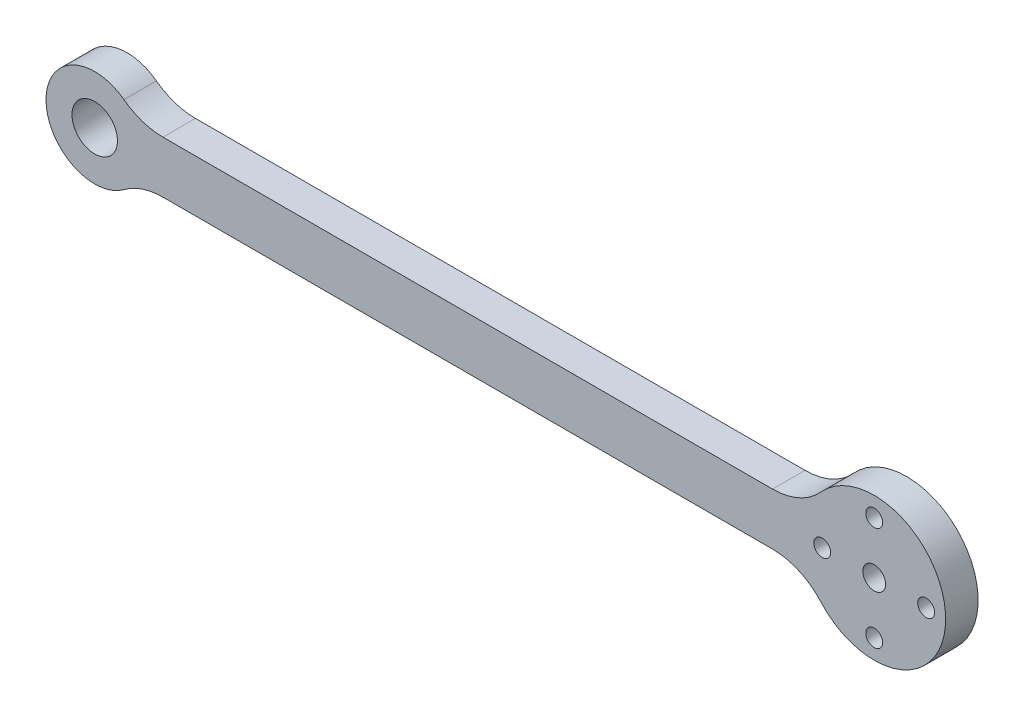
ISO-10303-21;
HEADER;
FILE_DESCRIPTION(('STEP AP214'),'2;1');
FILE_NAME('part.step','',(''),(''),'','','');
FILE_SCHEMA(('AUTOMOTIVE_DESIGN { 1 0 10303 214 1 1 1 1 }'));
ENDSEC;
DATA;
#1=APPLICATION_CONTEXT('core data for automotive mechanical design processes');
#2=APPLICATION_PROTOCOL_DEFINITION('international standard','automotive_design',2000,#1);
#3=PRODUCT_CONTEXT('',#1,'mechanical');
#4=PRODUCT('Part','Part','',(#3));
#5=PRODUCT_RELATED_PRODUCT_CATEGORY('part','',(#4));
#6=PRODUCT_DEFINITION_FORMATION('','',#4);
#7=PRODUCT_DEFINITION_CONTEXT('part definition',#1,'design');
#8=PRODUCT_DEFINITION('design','',#6,#7);
#9=PRODUCT_DEFINITION_SHAPE('','',#8);
#10=(LENGTH_UNIT() NAMED_UNIT(*) SI_UNIT(.MILLI.,.METRE.));
#11=(NAMED_UNIT(*) PLANE_ANGLE_UNIT() SI_UNIT($,.RADIAN.));
#12=(NAMED_UNIT(*) SI_UNIT($,.STERADIAN.) SOLID_ANGLE_UNIT());
#13=UNCERTAINTY_MEASURE_WITH_UNIT(LENGTH_MEASURE(1.E-05),#10,'distance_accuracy_value','');
#14=(GEOMETRIC_REPRESENTATION_CONTEXT(3) GLOBAL_UNCERTAINTY_ASSIGNED_CONTEXT((#13)) GLOBAL_UNIT_ASSIGNED_CONTEXT((#10,
#11,#12)) REPRESENTATION_CONTEXT('',''));
#15=CARTESIAN_POINT('',(0.,0.,0.));
#16=DIRECTION('',(0.,0.,1.));
#17=DIRECTION('',(1.,0.,0.));
#18=AXIS2_PLACEMENT_3D('',#15,#16,#17);
#19=CARTESIAN_POINT('',(0.,0.,-5.));
#20=DIRECTION('',(0.,0.,1.));
#21=DIRECTION('',(1.,0.,0.));
#22=AXIS2_PLACEMENT_3D('',#19,#20,#21);
#23=CYLINDRICAL_SURFACE('',#22,7.5);
#24=CARTESIAN_POINT('',(0.,0.,0.));
#25=DIRECTION('',(0.,0.,1.));
#26=DIRECTION('',(1.,0.,0.));
#27=AXIS2_PLACEMENT_3D('',#24,#25,#26);
#28=CIRCLE('',#27,7.5);
#29=CARTESIAN_POINT('',(4.5,6.,0.));
#30=VERTEX_POINT('',#29);
#31=CARTESIAN_POINT('',(4.5,-6.,0.));
#32=VERTEX_POINT('',#31);
#33=EDGE_CURVE('E174',#30,#32,#28,.T.);
#34=ORIENTED_EDGE('',*,*,#33,.F.);
#35=DIRECTION('',(0.,0.,1.));
#36=VECTOR('',#35,1.);
#37=CARTESIAN_POINT('',(4.5,6.,-5.));
#38=LINE('',#37,#36);
#39=CARTESIAN_POINT('',(4.5,6.,-5.));
#40=VERTEX_POINT('',#39);
#41=EDGE_CURVE('E121',#30,#40,#38,.F.);
#42=ORIENTED_EDGE('',*,*,#41,.T.);
#43=CARTESIAN_POINT('',(0.,0.,-5.));
#44=DIRECTION('',(0.,0.,1.));
#45=DIRECTION('',(1.,0.,0.));
#46=AXIS2_PLACEMENT_3D('',#43,#44,#45);
#47=CIRCLE('',#46,7.5);
#48=CARTESIAN_POINT('',(4.5,-6.,-5.));
#49=VERTEX_POINT('',#48);
#50=EDGE_CURVE('E112',#40,#49,#47,.T.);
#51=ORIENTED_EDGE('',*,*,#50,.T.);
#52=DIRECTION('',(0.,0.,1.));
#53=VECTOR('',#52,1.);
#54=CARTESIAN_POINT('',(4.5,-6.,-5.));
#55=LINE('',#54,#53);
#56=EDGE_CURVE('E129',#49,#32,#55,.T.);
#57=ORIENTED_EDGE('',*,*,#56,.T.);
#58=EDGE_LOOP('',(#34,#42,#51,#57));
#59=FACE_BOUND('',#58,.T.);
#60=ADVANCED_FACE('F37',(#59),#23,.T.);
#61=CARTESIAN_POINT('',(6.34428877022476,4.,-5.));
#62=DIRECTION('',(0.,1.,0.));
#63=DIRECTION('',(0.,0.,1.));
#64=AXIS2_PLACEMENT_3D('',#61,#62,#63);
#65=PLANE('',#64);
#66=DIRECTION('',(-1.,0.,0.));
#67=VECTOR('',#66,1.);
#68=CARTESIAN_POINT('',(6.34428877022476,4.,0.));
#69=LINE('',#68,#67);
#70=CARTESIAN_POINT('',(104.347524157501,4.,0.));
#71=VERTEX_POINT('',#70);
#72=CARTESIAN_POINT('',(10.5,4.,0.));
#73=VERTEX_POINT('',#72);
#74=EDGE_CURVE('E101',#71,#73,#69,.T.);
#75=ORIENTED_EDGE('',*,*,#74,.F.);
#76=DIRECTION('',(0.,0.,-1.));
#77=VECTOR('',#76,1.);
#78=CARTESIAN_POINT('',(104.347524157501,4.,-5.));
#79=LINE('',#78,#77);
#80=CARTESIAN_POINT('',(104.347524157501,4.,-5.));
#81=VERTEX_POINT('',#80);
#82=EDGE_CURVE('E149',#71,#81,#79,.T.);
#83=ORIENTED_EDGE('',*,*,#82,.T.);
#84=DIRECTION('',(-1.,0.,0.));
#85=VECTOR('',#84,1.);
#86=CARTESIAN_POINT('',(6.34428877022476,4.,-5.));
#87=LINE('',#86,#85);
#88=CARTESIAN_POINT('',(10.5,4.,-5.));
#89=VERTEX_POINT('',#88);
#90=EDGE_CURVE('E127',#81,#89,#87,.T.);
#91=ORIENTED_EDGE('',*,*,#90,.T.);
#92=DIRECTION('',(0.,0.,-1.));
#93=VECTOR('',#92,1.);
#94=CARTESIAN_POINT('',(10.5,4.,0.));
#95=LINE('',#94,#93);
#96=EDGE_CURVE('E120',#89,#73,#95,.F.);
#97=ORIENTED_EDGE('',*,*,#96,.T.);
#98=EDGE_LOOP('',(#75,#83,#91,#97));
#99=FACE_BOUND('',#98,.T.);
#100=ADVANCED_FACE('F125',(#99),#65,.T.);
#101=CARTESIAN_POINT('',(120.,0.,-5.));
#102=DIRECTION('',(0.,0.,1.));
#103=DIRECTION('',(1.,0.,0.));
#104=AXIS2_PLACEMENT_3D('',#101,#102,#103);
#105=CYLINDRICAL_SURFACE('',#104,11.);
#106=CARTESIAN_POINT('',(120.,0.,-5.));
#107=DIRECTION('',(0.,0.,1.));
#108=DIRECTION('',(1.,0.,0.));
#109=AXIS2_PLACEMENT_3D('',#106,#107,#108);
#110=CIRCLE('',#109,11.);
#111=CARTESIAN_POINT('',(111.801084082501,-7.33333333333334,-5.));
#112=VERTEX_POINT('',#111);
#113=CARTESIAN_POINT('',(111.801084082501,7.33333333333334,-5.));
#114=VERTEX_POINT('',#113);
#115=EDGE_CURVE('E133',#112,#114,#110,.T.);
#116=ORIENTED_EDGE('',*,*,#115,.T.);
#117=DIRECTION('',(0.,0.,1.));
#118=VECTOR('',#117,1.);
#119=CARTESIAN_POINT('',(111.801084082501,7.33333333333333,-5.));
#120=LINE('',#119,#118);
#121=CARTESIAN_POINT('',(111.801084082501,7.33333333333334,0.));
#122=VERTEX_POINT('',#121);
#123=EDGE_CURVE('E146',#114,#122,#120,.T.);
#124=ORIENTED_EDGE('',*,*,#123,.T.);
#125=CARTESIAN_POINT('',(120.,0.,0.));
#126=DIRECTION('',(0.,0.,1.));
#127=DIRECTION('',(1.,0.,0.));
#128=AXIS2_PLACEMENT_3D('',#125,#126,#127);
#129=CIRCLE('',#128,11.);
#130=CARTESIAN_POINT('',(111.801084082501,-7.33333333333334,0.));
#131=VERTEX_POINT('',#130);
#132=EDGE_CURVE('E113',#131,#122,#129,.T.);
#133=ORIENTED_EDGE('',*,*,#132,.F.);
#134=DIRECTION('',(0.,0.,1.));
#135=VECTOR('',#134,1.);
#136=CARTESIAN_POINT('',(111.801084082501,-7.33333333333333,-5.));
#137=LINE('',#136,#135);
#138=EDGE_CURVE('E144',#131,#112,#137,.F.);
#139=ORIENTED_EDGE('',*,*,#138,.T.);
#140=EDGE_LOOP('',(#116,#124,#133,#139));
#141=FACE_BOUND('',#140,.T.);
#142=ADVANCED_FACE('F161',(#141),#105,.T.);
#143=CARTESIAN_POINT('',(6.34428877022476,-4.,-5.));
#144=DIRECTION('',(0.,-1.,0.));
#145=DIRECTION('',(0.,0.,-1.));
#146=AXIS2_PLACEMENT_3D('',#143,#144,#145);
#147=PLANE('',#146);
#148=DIRECTION('',(1.,0.,0.));
#149=VECTOR('',#148,1.);
#150=CARTESIAN_POINT('',(6.34428877022476,-4.,-5.));
#151=LINE('',#150,#149);
#152=CARTESIAN_POINT('',(10.5,-4.,-5.));
#153=VERTEX_POINT('',#152);
#154=CARTESIAN_POINT('',(104.347524157501,-4.,-5.));
#155=VERTEX_POINT('',#154);
#156=EDGE_CURVE('E166',#153,#155,#151,.T.);
#157=ORIENTED_EDGE('',*,*,#156,.T.);
#158=DIRECTION('',(0.,0.,-1.));
#159=VECTOR('',#158,1.);
#160=CARTESIAN_POINT('',(104.347524157501,-4.,0.));
#161=LINE('',#160,#159);
#162=CARTESIAN_POINT('',(104.347524157501,-4.,0.));
#163=VERTEX_POINT('',#162);
#164=EDGE_CURVE('E151',#155,#163,#161,.F.);
#165=ORIENTED_EDGE('',*,*,#164,.T.);
#166=DIRECTION('',(1.,0.,0.));
#167=VECTOR('',#166,1.);
#168=CARTESIAN_POINT('',(6.34428877022476,-4.,0.));
#169=LINE('',#168,#167);
#170=CARTESIAN_POINT('',(10.5,-4.,0.));
#171=VERTEX_POINT('',#170);
#172=EDGE_CURVE('E158',#171,#163,#169,.T.);
#173=ORIENTED_EDGE('',*,*,#172,.F.);
#174=DIRECTION('',(0.,0.,-1.));
#175=VECTOR('',#174,1.);
#176=CARTESIAN_POINT('',(10.5,-4.,-5.));
#177=LINE('',#176,#175);
#178=EDGE_CURVE('E123',#171,#153,#177,.T.);
#179=ORIENTED_EDGE('',*,*,#178,.T.);
#180=EDGE_LOOP('',(#157,#165,#173,#179));
#181=FACE_BOUND('',#180,.T.);
#182=ADVANCED_FACE('F164',(#181),#147,.T.);
#183=CARTESIAN_POINT('',(0.,0.,-5.));
#184=DIRECTION('',(0.,0.,1.));
#185=DIRECTION('',(1.,0.,0.));
#186=AXIS2_PLACEMENT_3D('',#183,#184,#185);
#187=PLANE('',#186);
#188=CARTESIAN_POINT('',(120.,0.,-5.));
#189=DIRECTION('',(0.,0.,1.));
#190=DIRECTION('',(1.,0.,0.));
#191=AXIS2_PLACEMENT_3D('',#188,#189,#190);
#192=CIRCLE('',#191,1.75);
#193=CARTESIAN_POINT('',(121.75,0.,-5.));
#194=VERTEX_POINT('',#193);
#195=EDGE_CURVE('E206',#194,#194,#192,.T.);
#196=ORIENTED_EDGE('',*,*,#195,.T.);
#197=EDGE_LOOP('',(#196));
#198=FACE_BOUND('',#197,.T.);
#199=CARTESIAN_POINT('',(120.,8.00000000000001,-5.));
#200=DIRECTION('',(0.,0.,1.));
#201=DIRECTION('',(1.,0.,0.));
#202=AXIS2_PLACEMENT_3D('',#199,#200,#201);
#203=CIRCLE('',#202,1.29999999999999);
#204=CARTESIAN_POINT('',(121.3,8.00000000000001,-5.));
#205=VERTEX_POINT('',#204);
#206=EDGE_CURVE('E200',#205,#205,#203,.T.);
#207=ORIENTED_EDGE('',*,*,#206,.T.);
#208=EDGE_LOOP('',(#207));
#209=FACE_BOUND('',#208,.T.);
#210=CARTESIAN_POINT('',(128.,0.,-5.));
#211=DIRECTION('',(0.,0.,1.));
#212=DIRECTION('',(1.,0.,0.));
#213=AXIS2_PLACEMENT_3D('',#210,#211,#212);
#214=CIRCLE('',#213,1.30000000000001);
#215=CARTESIAN_POINT('',(129.3,0.,-5.));
#216=VERTEX_POINT('',#215);
#217=EDGE_CURVE('E194',#216,#216,#214,.T.);
#218=ORIENTED_EDGE('',*,*,#217,.T.);
#219=EDGE_LOOP('',(#218));
#220=FACE_BOUND('',#219,.T.);
#221=CARTESIAN_POINT('',(112.,0.,-5.));
#222=DIRECTION('',(0.,0.,1.));
#223=DIRECTION('',(1.,0.,0.));
#224=AXIS2_PLACEMENT_3D('',#221,#222,#223);
#225=CIRCLE('',#224,1.29999999999999);
#226=CARTESIAN_POINT('',(113.3,0.,-5.));
#227=VERTEX_POINT('',#226);
#228=EDGE_CURVE('E188',#227,#227,#225,.T.);
#229=ORIENTED_EDGE('',*,*,#228,.T.);
#230=EDGE_LOOP('',(#229));
#231=FACE_BOUND('',#230,.T.);
#232=CARTESIAN_POINT('',(120.,-8.00000000000001,-5.));
#233=DIRECTION('',(0.,0.,1.));
#234=DIRECTION('',(1.,0.,0.));
#235=AXIS2_PLACEMENT_3D('',#232,#233,#234);
#236=CIRCLE('',#235,1.29999999999999);
#237=CARTESIAN_POINT('',(121.3,-8.00000000000001,-5.));
#238=VERTEX_POINT('',#237);
#239=EDGE_CURVE('E183',#238,#238,#236,.T.);
#240=ORIENTED_EDGE('',*,*,#239,.T.);
#241=EDGE_LOOP('',(#240));
#242=FACE_BOUND('',#241,.T.);
#243=CARTESIAN_POINT('',(0.,0.,-5.));
#244=DIRECTION('',(0.,0.,1.));
#245=DIRECTION('',(1.,0.,0.));
#246=AXIS2_PLACEMENT_3D('',#243,#244,#245);
#247=CIRCLE('',#246,3.5);
#248=CARTESIAN_POINT('',(3.5,0.,-5.));
#249=VERTEX_POINT('',#248);
#250=EDGE_CURVE('E176',#249,#249,#247,.T.);
#251=ORIENTED_EDGE('',*,*,#250,.T.);
#252=EDGE_LOOP('',(#251));
#253=FACE_BOUND('',#252,.T.);
#254=ORIENTED_EDGE('',*,*,#50,.F.);
#255=CARTESIAN_POINT('',(10.5,14.,-5.));
#256=DIRECTION('',(0.,0.,1.));
#257=DIRECTION('',(1.,0.,0.));
#258=AXIS2_PLACEMENT_3D('',#255,#256,#257);
#259=CIRCLE('',#258,10.);
#260=EDGE_CURVE('E122',#40,#89,#259,.T.);
#261=ORIENTED_EDGE('',*,*,#260,.T.);
#262=ORIENTED_EDGE('',*,*,#90,.F.);
#263=CARTESIAN_POINT('',(104.347524157501,14.,-5.));
#264=DIRECTION('',(0.,0.,1.));
#265=DIRECTION('',(1.,0.,0.));
#266=AXIS2_PLACEMENT_3D('',#263,#264,#265);
#267=CIRCLE('',#266,10.);
#268=EDGE_CURVE('E154',#81,#114,#267,.T.);
#269=ORIENTED_EDGE('',*,*,#268,.T.);
#270=ORIENTED_EDGE('',*,*,#115,.F.);
#271=CARTESIAN_POINT('',(104.347524157501,-14.,-5.));
#272=DIRECTION('',(0.,0.,1.));
#273=DIRECTION('',(1.,0.,0.));
#274=AXIS2_PLACEMENT_3D('',#271,#272,#273);
#275=CIRCLE('',#274,10.);
#276=EDGE_CURVE('E11',#112,#155,#275,.T.);
#277=ORIENTED_EDGE('',*,*,#276,.T.);
#278=ORIENTED_EDGE('',*,*,#156,.F.);
#279=CARTESIAN_POINT('',(10.5,-14.,-5.));
#280=DIRECTION('',(0.,0.,1.));
#281=DIRECTION('',(1.,0.,0.));
#282=AXIS2_PLACEMENT_3D('',#279,#280,#281);
#283=CIRCLE('',#282,10.);
#284=EDGE_CURVE('E142',#153,#49,#283,.T.);
#285=ORIENTED_EDGE('',*,*,#284,.T.);
#286=EDGE_LOOP('',(#254,#261,#262,#269,#270,#277,#278,#285));
#287=FACE_BOUND('',#286,.T.);
#288=ADVANCED_FACE('F215',(#198,#209,#220,#231,#242,#253,#287),#187,.F.);
#289=CARTESIAN_POINT('',(0.,0.,0.));
#290=DIRECTION('',(0.,0.,1.));
#291=DIRECTION('',(1.,0.,0.));
#292=AXIS2_PLACEMENT_3D('',#289,#290,#291);
#293=PLANE('',#292);
#294=CARTESIAN_POINT('',(120.,0.,0.));
#295=DIRECTION('',(0.,0.,1.));
#296=DIRECTION('',(1.,0.,0.));
#297=AXIS2_PLACEMENT_3D('',#294,#295,#296);
#298=CIRCLE('',#297,1.75);
#299=CARTESIAN_POINT('',(121.75,0.,0.));
#300=VERTEX_POINT('',#299);
#301=EDGE_CURVE('E209',#300,#300,#298,.T.);
#302=ORIENTED_EDGE('',*,*,#301,.F.);
#303=EDGE_LOOP('',(#302));
#304=FACE_BOUND('',#303,.T.);
#305=CARTESIAN_POINT('',(120.,8.00000000000001,0.));
#306=DIRECTION('',(0.,0.,1.));
#307=DIRECTION('',(1.,0.,0.));
#308=AXIS2_PLACEMENT_3D('',#305,#306,#307);
#309=CIRCLE('',#308,1.29999999999999);
#310=CARTESIAN_POINT('',(121.3,8.00000000000001,0.));
#311=VERTEX_POINT('',#310);
#312=EDGE_CURVE('E203',#311,#311,#309,.T.);
#313=ORIENTED_EDGE('',*,*,#312,.F.);
#314=EDGE_LOOP('',(#313));
#315=FACE_BOUND('',#314,.T.);
#316=CARTESIAN_POINT('',(128.,0.,0.));
#317=DIRECTION('',(0.,0.,1.));
#318=DIRECTION('',(1.,0.,0.));
#319=AXIS2_PLACEMENT_3D('',#316,#317,#318);
#320=CIRCLE('',#319,1.30000000000001);
#321=CARTESIAN_POINT('',(129.3,0.,0.));
#322=VERTEX_POINT('',#321);
#323=EDGE_CURVE('E197',#322,#322,#320,.T.);
#324=ORIENTED_EDGE('',*,*,#323,.F.);
#325=EDGE_LOOP('',(#324));
#326=FACE_BOUND('',#325,.T.);
#327=CARTESIAN_POINT('',(112.,0.,0.));
#328=DIRECTION('',(0.,0.,1.));
#329=DIRECTION('',(1.,0.,0.));
#330=AXIS2_PLACEMENT_3D('',#327,#328,#329);
#331=CIRCLE('',#330,1.29999999999999);
#332=CARTESIAN_POINT('',(113.3,0.,0.));
#333=VERTEX_POINT('',#332);
#334=EDGE_CURVE('E191',#333,#333,#331,.T.);
#335=ORIENTED_EDGE('',*,*,#334,.F.);
#336=EDGE_LOOP('',(#335));
#337=FACE_BOUND('',#336,.T.);
#338=CARTESIAN_POINT('',(120.,-8.00000000000001,0.));
#339=DIRECTION('',(0.,0.,1.));
#340=DIRECTION('',(1.,0.,0.));
#341=AXIS2_PLACEMENT_3D('',#338,#339,#340);
#342=CIRCLE('',#341,1.29999999999999);
#343=CARTESIAN_POINT('',(121.3,-8.00000000000001,0.));
#344=VERTEX_POINT('',#343);
#345=EDGE_CURVE('E185',#344,#344,#342,.T.);
#346=ORIENTED_EDGE('',*,*,#345,.F.);
#347=EDGE_LOOP('',(#346));
#348=FACE_BOUND('',#347,.T.);
#349=CARTESIAN_POINT('',(0.,0.,0.));
#350=DIRECTION('',(0.,0.,1.));
#351=DIRECTION('',(1.,0.,0.));
#352=AXIS2_PLACEMENT_3D('',#349,#350,#351);
#353=CIRCLE('',#352,3.5);
#354=CARTESIAN_POINT('',(3.5,0.,0.));
#355=VERTEX_POINT('',#354);
#356=EDGE_CURVE('E178',#355,#355,#353,.T.);
#357=ORIENTED_EDGE('',*,*,#356,.F.);
#358=EDGE_LOOP('',(#357));
#359=FACE_BOUND('',#358,.T.);
#360=ORIENTED_EDGE('',*,*,#132,.T.);
#361=CARTESIAN_POINT('',(104.347524157501,14.,0.));
#362=DIRECTION('',(0.,0.,1.));
#363=DIRECTION('',(1.,0.,0.));
#364=AXIS2_PLACEMENT_3D('',#361,#362,#363);
#365=CIRCLE('',#364,10.);
#366=EDGE_CURVE('E108',#122,#71,#365,.F.);
#367=ORIENTED_EDGE('',*,*,#366,.T.);
#368=ORIENTED_EDGE('',*,*,#74,.T.);
#369=CARTESIAN_POINT('',(10.5,14.,0.));
#370=DIRECTION('',(0.,0.,1.));
#371=DIRECTION('',(1.,0.,0.));
#372=AXIS2_PLACEMENT_3D('',#369,#370,#371);
#373=CIRCLE('',#372,10.);
#374=EDGE_CURVE('E106',#73,#30,#373,.F.);
#375=ORIENTED_EDGE('',*,*,#374,.T.);
#376=ORIENTED_EDGE('',*,*,#33,.T.);
#377=CARTESIAN_POINT('',(10.5,-14.,0.));
#378=DIRECTION('',(0.,0.,1.));
#379=DIRECTION('',(1.,0.,0.));
#380=AXIS2_PLACEMENT_3D('',#377,#378,#379);
#381=CIRCLE('',#380,10.);
#382=EDGE_CURVE('E140',#32,#171,#381,.F.);
#383=ORIENTED_EDGE('',*,*,#382,.T.);
#384=ORIENTED_EDGE('',*,*,#172,.T.);
#385=CARTESIAN_POINT('',(104.347524157501,-14.,0.));
#386=DIRECTION('',(0.,0.,1.));
#387=DIRECTION('',(1.,0.,0.));
#388=AXIS2_PLACEMENT_3D('',#385,#386,#387);
#389=CIRCLE('',#388,10.);
#390=EDGE_CURVE('E45',#163,#131,#389,.F.);
#391=ORIENTED_EDGE('',*,*,#390,.T.);
#392=EDGE_LOOP('',(#360,#367,#368,#375,#376,#383,#384,#391));
#393=FACE_BOUND('',#392,.T.);
#394=ADVANCED_FACE('F104',(#304,#315,#326,#337,#348,#359,#393),#293,.T.);
#395=CARTESIAN_POINT('',(0.,0.,-5.));
#396=DIRECTION('',(0.,0.,1.));
#397=DIRECTION('',(1.,0.,0.));
#398=AXIS2_PLACEMENT_3D('',#395,#396,#397);
#399=CYLINDRICAL_SURFACE('',#398,3.5);
#400=ORIENTED_EDGE('',*,*,#250,.F.);
#401=EDGE_LOOP('',(#400));
#402=FACE_BOUND('',#401,.T.);
#403=ORIENTED_EDGE('',*,*,#356,.T.);
#404=EDGE_LOOP('',(#403));
#405=FACE_BOUND('',#404,.T.);
#406=ADVANCED_FACE('F227',(#402,#405),#399,.F.);
#407=CARTESIAN_POINT('',(120.,-8.00000000000001,-5.));
#408=DIRECTION('',(0.,0.,1.));
#409=DIRECTION('',(1.,0.,0.));
#410=AXIS2_PLACEMENT_3D('',#407,#408,#409);
#411=CYLINDRICAL_SURFACE('',#410,1.29999999999999);
#412=ORIENTED_EDGE('',*,*,#239,.F.);
#413=EDGE_LOOP('',(#412));
#414=FACE_BOUND('',#413,.T.);
#415=ORIENTED_EDGE('',*,*,#345,.T.);
#416=EDGE_LOOP('',(#415));
#417=FACE_BOUND('',#416,.T.);
#418=ADVANCED_FACE('F240',(#414,#417),#411,.F.);
#419=CARTESIAN_POINT('',(112.,0.,-5.));
#420=DIRECTION('',(0.,0.,1.));
#421=DIRECTION('',(1.,0.,0.));
#422=AXIS2_PLACEMENT_3D('',#419,#420,#421);
#423=CYLINDRICAL_SURFACE('',#422,1.29999999999999);
#424=ORIENTED_EDGE('',*,*,#228,.F.);
#425=EDGE_LOOP('',(#424));
#426=FACE_BOUND('',#425,.T.);
#427=ORIENTED_EDGE('',*,*,#334,.T.);
#428=EDGE_LOOP('',(#427));
#429=FACE_BOUND('',#428,.T.);
#430=ADVANCED_FACE('F246',(#426,#429),#423,.F.);
#431=CARTESIAN_POINT('',(128.,0.,-5.));
#432=DIRECTION('',(0.,0.,1.));
#433=DIRECTION('',(1.,0.,0.));
#434=AXIS2_PLACEMENT_3D('',#431,#432,#433);
#435=CYLINDRICAL_SURFACE('',#434,1.30000000000001);
#436=ORIENTED_EDGE('',*,*,#217,.F.);
#437=EDGE_LOOP('',(#436));
#438=FACE_BOUND('',#437,.T.);
#439=ORIENTED_EDGE('',*,*,#323,.T.);
#440=EDGE_LOOP('',(#439));
#441=FACE_BOUND('',#440,.T.);
#442=ADVANCED_FACE('F339',(#438,#441),#435,.F.);
#443=CARTESIAN_POINT('',(120.,8.00000000000001,-5.));
#444=DIRECTION('',(0.,0.,1.));
#445=DIRECTION('',(1.,0.,0.));
#446=AXIS2_PLACEMENT_3D('',#443,#444,#445);
#447=CYLINDRICAL_SURFACE('',#446,1.29999999999999);
#448=ORIENTED_EDGE('',*,*,#206,.F.);
#449=EDGE_LOOP('',(#448));
#450=FACE_BOUND('',#449,.T.);
#451=ORIENTED_EDGE('',*,*,#312,.T.);
#452=EDGE_LOOP('',(#451));
#453=FACE_BOUND('',#452,.T.);
#454=ADVANCED_FACE('F221',(#450,#453),#447,.F.);
#455=CARTESIAN_POINT('',(120.,0.,-5.));
#456=DIRECTION('',(0.,0.,1.));
#457=DIRECTION('',(1.,0.,0.));
#458=AXIS2_PLACEMENT_3D('',#455,#456,#457);
#459=CYLINDRICAL_SURFACE('',#458,1.75);
#460=ORIENTED_EDGE('',*,*,#195,.F.);
#461=EDGE_LOOP('',(#460));
#462=FACE_BOUND('',#461,.T.);
#463=ORIENTED_EDGE('',*,*,#301,.T.);
#464=EDGE_LOOP('',(#463));
#465=FACE_BOUND('',#464,.T.);
#466=ADVANCED_FACE('F218',(#462,#465),#459,.F.);
#467=CARTESIAN_POINT('',(10.5,14.,-5.));
#468=DIRECTION('',(0.,0.,1.));
#469=DIRECTION('',(1.,0.,0.));
#470=AXIS2_PLACEMENT_3D('',#467,#468,#469);
#471=CYLINDRICAL_SURFACE('',#470,10.);
#472=ORIENTED_EDGE('',*,*,#260,.F.);
#473=ORIENTED_EDGE('',*,*,#41,.F.);
#474=ORIENTED_EDGE('',*,*,#374,.F.);
#475=ORIENTED_EDGE('',*,*,#96,.F.);
#476=EDGE_LOOP('',(#472,#473,#474,#475));
#477=FACE_BOUND('',#476,.T.);
#478=ADVANCED_FACE('F119',(#477),#471,.F.);
#479=CARTESIAN_POINT('',(10.5,-14.,-5.));
#480=DIRECTION('',(0.,0.,1.));
#481=DIRECTION('',(1.,0.,0.));
#482=AXIS2_PLACEMENT_3D('',#479,#480,#481);
#483=CYLINDRICAL_SURFACE('',#482,10.);
#484=ORIENTED_EDGE('',*,*,#284,.F.);
#485=ORIENTED_EDGE('',*,*,#178,.F.);
#486=ORIENTED_EDGE('',*,*,#382,.F.);
#487=ORIENTED_EDGE('',*,*,#56,.F.);
#488=EDGE_LOOP('',(#484,#485,#486,#487));
#489=FACE_BOUND('',#488,.T.);
#490=ADVANCED_FACE('F262',(#489),#483,.F.);
#491=CARTESIAN_POINT('',(104.347524157501,14.,-5.));
#492=DIRECTION('',(0.,0.,1.));
#493=DIRECTION('',(1.,0.,0.));
#494=AXIS2_PLACEMENT_3D('',#491,#492,#493);
#495=CYLINDRICAL_SURFACE('',#494,10.);
#496=ORIENTED_EDGE('',*,*,#268,.F.);
#497=ORIENTED_EDGE('',*,*,#82,.F.);
#498=ORIENTED_EDGE('',*,*,#366,.F.);
#499=ORIENTED_EDGE('',*,*,#123,.F.);
#500=EDGE_LOOP('',(#496,#497,#498,#499));
#501=FACE_BOUND('',#500,.T.);
#502=ADVANCED_FACE('F264',(#501),#495,.F.);
#503=CARTESIAN_POINT('',(104.347524157501,-14.,-5.));
#504=DIRECTION('',(0.,0.,1.));
#505=DIRECTION('',(1.,0.,0.));
#506=AXIS2_PLACEMENT_3D('',#503,#504,#505);
#507=CYLINDRICAL_SURFACE('',#506,10.);
#508=ORIENTED_EDGE('',*,*,#276,.F.);
#509=ORIENTED_EDGE('',*,*,#138,.F.);
#510=ORIENTED_EDGE('',*,*,#390,.F.);
#511=ORIENTED_EDGE('',*,*,#164,.F.);
#512=EDGE_LOOP('',(#508,#509,#510,#511));
#513=FACE_BOUND('',#512,.T.);
#514=ADVANCED_FACE('F39',(#513),#507,.F.);
#515=CLOSED_SHELL('',(#60,#100,#142,#182,#288,#394,#406,#418,#430,#442,#454,#466,#478,#490,#502,#514));
#516=MANIFOLD_SOLID_BREP('B2',#515);
#517=ADVANCED_BREP_SHAPE_REPRESENTATION('',(#18,#516),#14);
#518=SHAPE_DEFINITION_REPRESENTATION(#9,#517);
ENDSEC;
END-ISO-10303-21;
